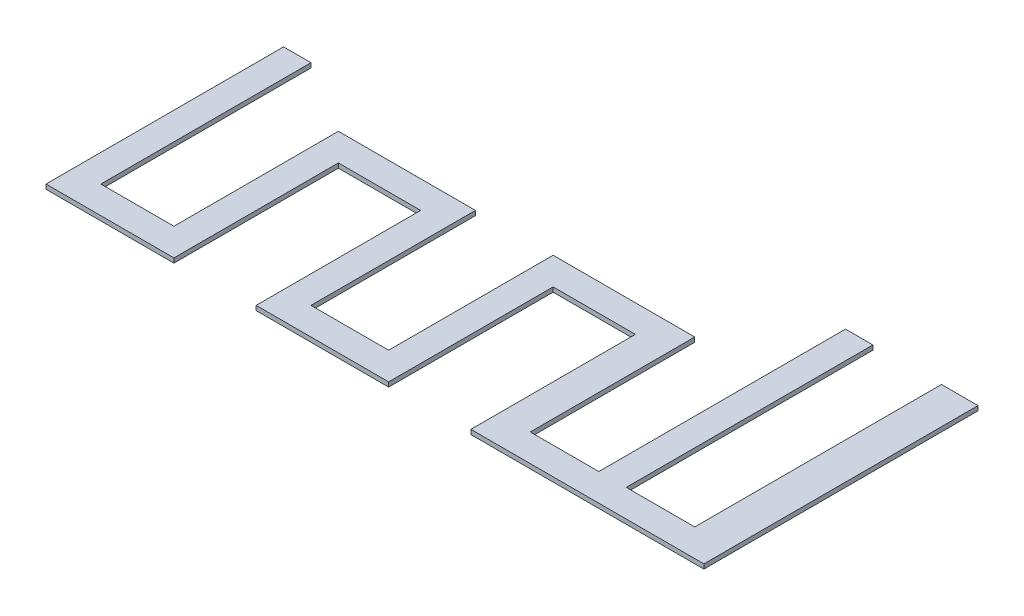
ISO-10303-21;
HEADER;
FILE_DESCRIPTION(('STEP AP214'),'2;1');
FILE_NAME('part.step','',(''),(''),'','','');
FILE_SCHEMA(('AUTOMOTIVE_DESIGN { 1 0 10303 214 1 1 1 1 }'));
ENDSEC;
DATA;
#1=APPLICATION_CONTEXT('core data for automotive mechanical design processes');
#2=APPLICATION_PROTOCOL_DEFINITION('international standard','automotive_design',2000,#1);
#3=PRODUCT_CONTEXT('',#1,'mechanical');
#4=PRODUCT('Part','Part','',(#3));
#5=PRODUCT_RELATED_PRODUCT_CATEGORY('part','',(#4));
#6=PRODUCT_DEFINITION_FORMATION('','',#4);
#7=PRODUCT_DEFINITION_CONTEXT('part definition',#1,'design');
#8=PRODUCT_DEFINITION('design','',#6,#7);
#9=PRODUCT_DEFINITION_SHAPE('','',#8);
#10=(LENGTH_UNIT() NAMED_UNIT(*) SI_UNIT(.MILLI.,.METRE.));
#11=(NAMED_UNIT(*) PLANE_ANGLE_UNIT() SI_UNIT($,.RADIAN.));
#12=(NAMED_UNIT(*) SI_UNIT($,.STERADIAN.) SOLID_ANGLE_UNIT());
#13=UNCERTAINTY_MEASURE_WITH_UNIT(LENGTH_MEASURE(1.E-05),#10,'distance_accuracy_value','');
#14=(GEOMETRIC_REPRESENTATION_CONTEXT(3) GLOBAL_UNCERTAINTY_ASSIGNED_CONTEXT((#13)) GLOBAL_UNIT_ASSIGNED_CONTEXT((#10,
#11,#12)) REPRESENTATION_CONTEXT('',''));
#15=CARTESIAN_POINT('',(0.,0.,0.));
#16=DIRECTION('',(0.,0.,1.));
#17=DIRECTION('',(1.,0.,0.));
#18=AXIS2_PLACEMENT_3D('',#15,#16,#17);
#19=CARTESIAN_POINT('',(-36.74,0.1,11.7573895615759));
#20=DIRECTION('',(0.,0.,1.));
#21=DIRECTION('',(1.,0.,0.));
#22=AXIS2_PLACEMENT_3D('',#19,#20,#21);
#23=PLANE('',#22);
#24=DIRECTION('',(-1.,0.,0.));
#25=VECTOR('',#24,1.);
#26=CARTESIAN_POINT('',(-36.74,0.,11.7573895615759));
#27=LINE('',#26,#25);
#28=CARTESIAN_POINT('',(-36.74,0.,11.7573895615759));
#29=VERTEX_POINT('',#28);
#30=CARTESIAN_POINT('',(-37.34,0.,11.7573895615759));
#31=VERTEX_POINT('',#30);
#32=EDGE_CURVE('E252',#29,#31,#27,.T.);
#33=ORIENTED_EDGE('',*,*,#32,.T.);
#34=DIRECTION('',(0.,-1.,0.));
#35=VECTOR('',#34,1.);
#36=CARTESIAN_POINT('',(-37.34,0.1,11.7573895615759));
#37=LINE('',#36,#35);
#38=CARTESIAN_POINT('',(-37.34,0.1,11.7573895615759));
#39=VERTEX_POINT('',#38);
#40=EDGE_CURVE('E11',#39,#31,#37,.T.);
#41=ORIENTED_EDGE('',*,*,#40,.F.);
#42=DIRECTION('',(-1.,0.,0.));
#43=VECTOR('',#42,1.);
#44=CARTESIAN_POINT('',(-36.74,0.1,11.7573895615759));
#45=LINE('',#44,#43);
#46=CARTESIAN_POINT('',(-36.74,0.1,11.7573895615759));
#47=VERTEX_POINT('',#46);
#48=EDGE_CURVE('E306',#47,#39,#45,.T.);
#49=ORIENTED_EDGE('',*,*,#48,.F.);
#50=DIRECTION('',(0.,-1.,0.));
#51=VECTOR('',#50,1.);
#52=CARTESIAN_POINT('',(-36.74,0.1,11.7573895615759));
#53=LINE('',#52,#51);
#54=EDGE_CURVE('E248',#47,#29,#53,.T.);
#55=ORIENTED_EDGE('',*,*,#54,.T.);
#56=EDGE_LOOP('',(#33,#41,#49,#55));
#57=FACE_BOUND('',#56,.T.);
#58=ADVANCED_FACE('F36',(#57),#23,.F.);
#59=CARTESIAN_POINT('',(-37.34,0.1,11.7573895615759));
#60=DIRECTION('',(1.,0.,0.));
#61=DIRECTION('',(0.,0.,-1.));
#62=AXIS2_PLACEMENT_3D('',#59,#60,#61);
#63=PLANE('',#62);
#64=DIRECTION('',(0.,0.,1.));
#65=VECTOR('',#64,1.);
#66=CARTESIAN_POINT('',(-37.34,0.,11.7573895615759));
#67=LINE('',#66,#65);
#68=CARTESIAN_POINT('',(-37.34,0.,16.9573895615759));
#69=VERTEX_POINT('',#68);
#70=EDGE_CURVE('E255',#31,#69,#67,.T.);
#71=ORIENTED_EDGE('',*,*,#70,.T.);
#72=DIRECTION('',(0.,-1.,0.));
#73=VECTOR('',#72,1.);
#74=CARTESIAN_POINT('',(-37.34,0.1,16.9573895615759));
#75=LINE('',#74,#73);
#76=CARTESIAN_POINT('',(-37.34,0.1,16.9573895615759));
#77=VERTEX_POINT('',#76);
#78=EDGE_CURVE('E44',#77,#69,#75,.T.);
#79=ORIENTED_EDGE('',*,*,#78,.F.);
#80=DIRECTION('',(0.,0.,1.));
#81=VECTOR('',#80,1.);
#82=CARTESIAN_POINT('',(-37.34,0.1,11.7573895615759));
#83=LINE('',#82,#81);
#84=EDGE_CURVE('E155',#39,#77,#83,.T.);
#85=ORIENTED_EDGE('',*,*,#84,.F.);
#86=ORIENTED_EDGE('',*,*,#40,.T.);
#87=EDGE_LOOP('',(#71,#79,#85,#86));
#88=FACE_BOUND('',#87,.T.);
#89=ADVANCED_FACE('F464',(#88),#63,.F.);
#90=CARTESIAN_POINT('',(-37.34,0.1,16.9573895615759));
#91=DIRECTION('',(0.,0.,-1.));
#92=DIRECTION('',(-1.,0.,0.));
#93=AXIS2_PLACEMENT_3D('',#90,#91,#92);
#94=PLANE('',#93);
#95=DIRECTION('',(1.,0.,0.));
#96=VECTOR('',#95,1.);
#97=CARTESIAN_POINT('',(-37.34,0.,16.9573895615759));
#98=LINE('',#97,#96);
#99=CARTESIAN_POINT('',(-34.54,0.,16.9573895615759));
#100=VERTEX_POINT('',#99);
#101=EDGE_CURVE('E257',#69,#100,#98,.T.);
#102=ORIENTED_EDGE('',*,*,#101,.T.);
#103=DIRECTION('',(0.,-1.,0.));
#104=VECTOR('',#103,1.);
#105=CARTESIAN_POINT('',(-34.54,0.1,16.9573895615759));
#106=LINE('',#105,#104);
#107=CARTESIAN_POINT('',(-34.54,0.1,16.9573895615759));
#108=VERTEX_POINT('',#107);
#109=EDGE_CURVE('E373',#108,#100,#106,.T.);
#110=ORIENTED_EDGE('',*,*,#109,.F.);
#111=DIRECTION('',(1.,0.,0.));
#112=VECTOR('',#111,1.);
#113=CARTESIAN_POINT('',(-37.34,0.1,16.9573895615759));
#114=LINE('',#113,#112);
#115=EDGE_CURVE('E381',#77,#108,#114,.T.);
#116=ORIENTED_EDGE('',*,*,#115,.F.);
#117=ORIENTED_EDGE('',*,*,#78,.T.);
#118=EDGE_LOOP('',(#102,#110,#116,#117));
#119=FACE_BOUND('',#118,.T.);
#120=ADVANCED_FACE('F379',(#119),#94,.F.);
#121=CARTESIAN_POINT('',(-34.54,0.1,16.9573895615759));
#122=DIRECTION('',(-1.,0.,0.));
#123=DIRECTION('',(0.,0.,1.));
#124=AXIS2_PLACEMENT_3D('',#121,#122,#123);
#125=PLANE('',#124);
#126=DIRECTION('',(0.,0.,-1.));
#127=VECTOR('',#126,1.);
#128=CARTESIAN_POINT('',(-34.54,0.,16.9573895615759));
#129=LINE('',#128,#127);
#130=CARTESIAN_POINT('',(-34.54,0.,13.3573895615759));
#131=VERTEX_POINT('',#130);
#132=EDGE_CURVE('E259',#100,#131,#129,.T.);
#133=ORIENTED_EDGE('',*,*,#132,.T.);
#134=DIRECTION('',(0.,-1.,0.));
#135=VECTOR('',#134,1.);
#136=CARTESIAN_POINT('',(-34.54,0.1,13.3573895615759));
#137=LINE('',#136,#135);
#138=CARTESIAN_POINT('',(-34.54,0.1,13.3573895615759));
#139=VERTEX_POINT('',#138);
#140=EDGE_CURVE('E370',#139,#131,#137,.T.);
#141=ORIENTED_EDGE('',*,*,#140,.F.);
#142=DIRECTION('',(0.,0.,-1.));
#143=VECTOR('',#142,1.);
#144=CARTESIAN_POINT('',(-34.54,0.1,16.9573895615759));
#145=LINE('',#144,#143);
#146=EDGE_CURVE('E399',#108,#139,#145,.T.);
#147=ORIENTED_EDGE('',*,*,#146,.F.);
#148=ORIENTED_EDGE('',*,*,#109,.T.);
#149=EDGE_LOOP('',(#133,#141,#147,#148));
#150=FACE_BOUND('',#149,.T.);
#151=ADVANCED_FACE('F390',(#150),#125,.F.);
#152=CARTESIAN_POINT('',(-34.54,0.1,13.3573895615759));
#153=DIRECTION('',(0.,0.,-1.));
#154=DIRECTION('',(-1.,0.,0.));
#155=AXIS2_PLACEMENT_3D('',#152,#153,#154);
#156=PLANE('',#155);
#157=DIRECTION('',(1.,0.,0.));
#158=VECTOR('',#157,1.);
#159=CARTESIAN_POINT('',(-34.54,0.,13.3573895615759));
#160=LINE('',#159,#158);
#161=CARTESIAN_POINT('',(-32.74,0.,13.3573895615759));
#162=VERTEX_POINT('',#161);
#163=EDGE_CURVE('E261',#131,#162,#160,.T.);
#164=ORIENTED_EDGE('',*,*,#163,.T.);
#165=DIRECTION('',(0.,-1.,0.));
#166=VECTOR('',#165,1.);
#167=CARTESIAN_POINT('',(-32.74,0.1,13.3573895615759));
#168=LINE('',#167,#166);
#169=CARTESIAN_POINT('',(-32.74,0.1,13.3573895615759));
#170=VERTEX_POINT('',#169);
#171=EDGE_CURVE('E367',#170,#162,#168,.T.);
#172=ORIENTED_EDGE('',*,*,#171,.F.);
#173=DIRECTION('',(1.,0.,0.));
#174=VECTOR('',#173,1.);
#175=CARTESIAN_POINT('',(-34.54,0.1,13.3573895615759));
#176=LINE('',#175,#174);
#177=EDGE_CURVE('E396',#139,#170,#176,.T.);
#178=ORIENTED_EDGE('',*,*,#177,.F.);
#179=ORIENTED_EDGE('',*,*,#140,.T.);
#180=EDGE_LOOP('',(#164,#172,#178,#179));
#181=FACE_BOUND('',#180,.T.);
#182=ADVANCED_FACE('F394',(#181),#156,.F.);
#183=CARTESIAN_POINT('',(-32.74,0.1,13.3573895615759));
#184=DIRECTION('',(1.,0.,0.));
#185=DIRECTION('',(0.,0.,-1.));
#186=AXIS2_PLACEMENT_3D('',#183,#184,#185);
#187=PLANE('',#186);
#188=DIRECTION('',(0.,0.,1.));
#189=VECTOR('',#188,1.);
#190=CARTESIAN_POINT('',(-32.74,0.,13.3573895615759));
#191=LINE('',#190,#189);
#192=CARTESIAN_POINT('',(-32.74,0.,16.9573895615759));
#193=VERTEX_POINT('',#192);
#194=EDGE_CURVE('E263',#162,#193,#191,.T.);
#195=ORIENTED_EDGE('',*,*,#194,.T.);
#196=DIRECTION('',(0.,-1.,0.));
#197=VECTOR('',#196,1.);
#198=CARTESIAN_POINT('',(-32.74,0.1,16.9573895615759));
#199=LINE('',#198,#197);
#200=CARTESIAN_POINT('',(-32.74,0.1,16.9573895615759));
#201=VERTEX_POINT('',#200);
#202=EDGE_CURVE('E364',#201,#193,#199,.T.);
#203=ORIENTED_EDGE('',*,*,#202,.F.);
#204=DIRECTION('',(0.,0.,1.));
#205=VECTOR('',#204,1.);
#206=CARTESIAN_POINT('',(-32.74,0.1,13.3573895615759));
#207=LINE('',#206,#205);
#208=EDGE_CURVE('E398',#170,#201,#207,.T.);
#209=ORIENTED_EDGE('',*,*,#208,.F.);
#210=ORIENTED_EDGE('',*,*,#171,.T.);
#211=EDGE_LOOP('',(#195,#203,#209,#210));
#212=FACE_BOUND('',#211,.T.);
#213=ADVANCED_FACE('F477',(#212),#187,.F.);
#214=CARTESIAN_POINT('',(-32.74,0.1,16.9573895615759));
#215=DIRECTION('',(0.,0.,-1.));
#216=DIRECTION('',(-1.,0.,0.));
#217=AXIS2_PLACEMENT_3D('',#214,#215,#216);
#218=PLANE('',#217);
#219=DIRECTION('',(1.,0.,0.));
#220=VECTOR('',#219,1.);
#221=CARTESIAN_POINT('',(-32.74,0.,16.9573895615759));
#222=LINE('',#221,#220);
#223=CARTESIAN_POINT('',(-29.84,0.,16.9573895615759));
#224=VERTEX_POINT('',#223);
#225=EDGE_CURVE('E265',#193,#224,#222,.T.);
#226=ORIENTED_EDGE('',*,*,#225,.T.);
#227=DIRECTION('',(0.,-1.,0.));
#228=VECTOR('',#227,1.);
#229=CARTESIAN_POINT('',(-29.84,0.1,16.9573895615759));
#230=LINE('',#229,#228);
#231=CARTESIAN_POINT('',(-29.84,0.1,16.9573895615759));
#232=VERTEX_POINT('',#231);
#233=EDGE_CURVE('E361',#232,#224,#230,.T.);
#234=ORIENTED_EDGE('',*,*,#233,.F.);
#235=DIRECTION('',(1.,0.,0.));
#236=VECTOR('',#235,1.);
#237=CARTESIAN_POINT('',(-32.74,0.1,16.9573895615759));
#238=LINE('',#237,#236);
#239=EDGE_CURVE('E401',#201,#232,#238,.T.);
#240=ORIENTED_EDGE('',*,*,#239,.F.);
#241=ORIENTED_EDGE('',*,*,#202,.T.);
#242=EDGE_LOOP('',(#226,#234,#240,#241));
#243=FACE_BOUND('',#242,.T.);
#244=ADVANCED_FACE('F480',(#243),#218,.F.);
#245=CARTESIAN_POINT('',(-29.84,0.1,16.9573895615759));
#246=DIRECTION('',(-1.,0.,0.));
#247=DIRECTION('',(0.,0.,1.));
#248=AXIS2_PLACEMENT_3D('',#245,#246,#247);
#249=PLANE('',#248);
#250=DIRECTION('',(0.,0.,-1.));
#251=VECTOR('',#250,1.);
#252=CARTESIAN_POINT('',(-29.84,0.,16.9573895615759));
#253=LINE('',#252,#251);
#254=CARTESIAN_POINT('',(-29.84,0.,13.3573895615759));
#255=VERTEX_POINT('',#254);
#256=EDGE_CURVE('E267',#224,#255,#253,.T.);
#257=ORIENTED_EDGE('',*,*,#256,.T.);
#258=DIRECTION('',(0.,-1.,0.));
#259=VECTOR('',#258,1.);
#260=CARTESIAN_POINT('',(-29.84,0.1,13.3573895615759));
#261=LINE('',#260,#259);
#262=CARTESIAN_POINT('',(-29.84,0.1,13.3573895615759));
#263=VERTEX_POINT('',#262);
#264=EDGE_CURVE('E358',#263,#255,#261,.T.);
#265=ORIENTED_EDGE('',*,*,#264,.F.);
#266=DIRECTION('',(0.,0.,-1.));
#267=VECTOR('',#266,1.);
#268=CARTESIAN_POINT('',(-29.84,0.1,16.9573895615759));
#269=LINE('',#268,#267);
#270=EDGE_CURVE('E407',#232,#263,#269,.T.);
#271=ORIENTED_EDGE('',*,*,#270,.F.);
#272=ORIENTED_EDGE('',*,*,#233,.T.);
#273=EDGE_LOOP('',(#257,#265,#271,#272));
#274=FACE_BOUND('',#273,.T.);
#275=ADVANCED_FACE('F484',(#274),#249,.F.);
#276=CARTESIAN_POINT('',(-29.84,0.1,13.3573895615759));
#277=DIRECTION('',(0.,0.,-1.));
#278=DIRECTION('',(-1.,0.,0.));
#279=AXIS2_PLACEMENT_3D('',#276,#277,#278);
#280=PLANE('',#279);
#281=DIRECTION('',(1.,0.,0.));
#282=VECTOR('',#281,1.);
#283=CARTESIAN_POINT('',(-29.84,0.,13.3573895615759));
#284=LINE('',#283,#282);
#285=CARTESIAN_POINT('',(-28.04,0.,13.3573895615759));
#286=VERTEX_POINT('',#285);
#287=EDGE_CURVE('E269',#255,#286,#284,.T.);
#288=ORIENTED_EDGE('',*,*,#287,.T.);
#289=DIRECTION('',(0.,-1.,0.));
#290=VECTOR('',#289,1.);
#291=CARTESIAN_POINT('',(-28.04,0.1,13.3573895615759));
#292=LINE('',#291,#290);
#293=CARTESIAN_POINT('',(-28.04,0.1,13.3573895615759));
#294=VERTEX_POINT('',#293);
#295=EDGE_CURVE('E355',#294,#286,#292,.T.);
#296=ORIENTED_EDGE('',*,*,#295,.F.);
#297=DIRECTION('',(1.,0.,0.));
#298=VECTOR('',#297,1.);
#299=CARTESIAN_POINT('',(-29.84,0.1,13.3573895615759));
#300=LINE('',#299,#298);
#301=EDGE_CURVE('E409',#263,#294,#300,.T.);
#302=ORIENTED_EDGE('',*,*,#301,.F.);
#303=ORIENTED_EDGE('',*,*,#264,.T.);
#304=EDGE_LOOP('',(#288,#296,#302,#303));
#305=FACE_BOUND('',#304,.T.);
#306=ADVANCED_FACE('F488',(#305),#280,.F.);
#307=CARTESIAN_POINT('',(-28.04,0.1,13.3573895615759));
#308=DIRECTION('',(1.,0.,0.));
#309=DIRECTION('',(0.,0.,-1.));
#310=AXIS2_PLACEMENT_3D('',#307,#308,#309);
#311=PLANE('',#310);
#312=DIRECTION('',(0.,0.,1.));
#313=VECTOR('',#312,1.);
#314=CARTESIAN_POINT('',(-28.04,0.,13.3573895615759));
#315=LINE('',#314,#313);
#316=CARTESIAN_POINT('',(-28.04,0.,16.9573895615759));
#317=VERTEX_POINT('',#316);
#318=EDGE_CURVE('E271',#286,#317,#315,.T.);
#319=ORIENTED_EDGE('',*,*,#318,.T.);
#320=DIRECTION('',(0.,-1.,0.));
#321=VECTOR('',#320,1.);
#322=CARTESIAN_POINT('',(-28.04,0.1,16.9573895615759));
#323=LINE('',#322,#321);
#324=CARTESIAN_POINT('',(-28.04,0.1,16.9573895615759));
#325=VERTEX_POINT('',#324);
#326=EDGE_CURVE('E352',#325,#317,#323,.T.);
#327=ORIENTED_EDGE('',*,*,#326,.F.);
#328=DIRECTION('',(0.,0.,1.));
#329=VECTOR('',#328,1.);
#330=CARTESIAN_POINT('',(-28.04,0.1,13.3573895615759));
#331=LINE('',#330,#329);
#332=EDGE_CURVE('E411',#294,#325,#331,.T.);
#333=ORIENTED_EDGE('',*,*,#332,.F.);
#334=ORIENTED_EDGE('',*,*,#295,.T.);
#335=EDGE_LOOP('',(#319,#327,#333,#334));
#336=FACE_BOUND('',#335,.T.);
#337=ADVANCED_FACE('F492',(#336),#311,.F.);
#338=CARTESIAN_POINT('',(-28.04,0.1,16.9573895615759));
#339=DIRECTION('',(0.,0.,-1.));
#340=DIRECTION('',(-1.,0.,0.));
#341=AXIS2_PLACEMENT_3D('',#338,#339,#340);
#342=PLANE('',#341);
#343=DIRECTION('',(1.,0.,0.));
#344=VECTOR('',#343,1.);
#345=CARTESIAN_POINT('',(-28.04,0.,16.9573895615759));
#346=LINE('',#345,#344);
#347=CARTESIAN_POINT('',(-22.94,0.,16.9573895615759));
#348=VERTEX_POINT('',#347);
#349=EDGE_CURVE('E273',#317,#348,#346,.T.);
#350=ORIENTED_EDGE('',*,*,#349,.T.);
#351=DIRECTION('',(0.,-1.,0.));
#352=VECTOR('',#351,1.);
#353=CARTESIAN_POINT('',(-22.94,0.1,16.9573895615759));
#354=LINE('',#353,#352);
#355=CARTESIAN_POINT('',(-22.94,0.1,16.9573895615759));
#356=VERTEX_POINT('',#355);
#357=EDGE_CURVE('E349',#356,#348,#354,.T.);
#358=ORIENTED_EDGE('',*,*,#357,.F.);
#359=DIRECTION('',(1.,0.,0.));
#360=VECTOR('',#359,1.);
#361=CARTESIAN_POINT('',(-28.04,0.1,16.9573895615759));
#362=LINE('',#361,#360);
#363=EDGE_CURVE('E413',#325,#356,#362,.T.);
#364=ORIENTED_EDGE('',*,*,#363,.F.);
#365=ORIENTED_EDGE('',*,*,#326,.T.);
#366=EDGE_LOOP('',(#350,#358,#364,#365));
#367=FACE_BOUND('',#366,.T.);
#368=ADVANCED_FACE('F496',(#367),#342,.F.);
#369=CARTESIAN_POINT('',(-22.94,0.1,16.9573895615759));
#370=DIRECTION('',(-1.,0.,0.));
#371=DIRECTION('',(0.,0.,1.));
#372=AXIS2_PLACEMENT_3D('',#369,#370,#371);
#373=PLANE('',#372);
#374=DIRECTION('',(0.,0.,-1.));
#375=VECTOR('',#374,1.);
#376=CARTESIAN_POINT('',(-22.94,0.,16.9573895615759));
#377=LINE('',#376,#375);
#378=CARTESIAN_POINT('',(-22.94,0.,10.9573895615759));
#379=VERTEX_POINT('',#378);
#380=EDGE_CURVE('E275',#348,#379,#377,.T.);
#381=ORIENTED_EDGE('',*,*,#380,.T.);
#382=DIRECTION('',(0.,-1.,0.));
#383=VECTOR('',#382,1.);
#384=CARTESIAN_POINT('',(-22.94,0.1,10.9573895615759));
#385=LINE('',#384,#383);
#386=CARTESIAN_POINT('',(-22.94,0.1,10.9573895615759));
#387=VERTEX_POINT('',#386);
#388=EDGE_CURVE('E346',#387,#379,#385,.T.);
#389=ORIENTED_EDGE('',*,*,#388,.F.);
#390=DIRECTION('',(0.,0.,-1.));
#391=VECTOR('',#390,1.);
#392=CARTESIAN_POINT('',(-22.94,0.1,16.9573895615759));
#393=LINE('',#392,#391);
#394=EDGE_CURVE('E415',#356,#387,#393,.T.);
#395=ORIENTED_EDGE('',*,*,#394,.F.);
#396=ORIENTED_EDGE('',*,*,#357,.T.);
#397=EDGE_LOOP('',(#381,#389,#395,#396));
#398=FACE_BOUND('',#397,.T.);
#399=ADVANCED_FACE('F500',(#398),#373,.F.);
#400=CARTESIAN_POINT('',(-22.94,0.1,10.9573895615759));
#401=DIRECTION('',(0.,0.,1.));
#402=DIRECTION('',(1.,0.,0.));
#403=AXIS2_PLACEMENT_3D('',#400,#401,#402);
#404=PLANE('',#403);
#405=DIRECTION('',(-1.,0.,0.));
#406=VECTOR('',#405,1.);
#407=CARTESIAN_POINT('',(-22.94,0.,10.9573895615759));
#408=LINE('',#407,#406);
#409=CARTESIAN_POINT('',(-23.74,0.,10.9573895615759));
#410=VERTEX_POINT('',#409);
#411=EDGE_CURVE('E277',#379,#410,#408,.T.);
#412=ORIENTED_EDGE('',*,*,#411,.T.);
#413=DIRECTION('',(0.,-1.,0.));
#414=VECTOR('',#413,1.);
#415=CARTESIAN_POINT('',(-23.74,0.1,10.9573895615759));
#416=LINE('',#415,#414);
#417=CARTESIAN_POINT('',(-23.74,0.1,10.9573895615759));
#418=VERTEX_POINT('',#417);
#419=EDGE_CURVE('E343',#418,#410,#416,.T.);
#420=ORIENTED_EDGE('',*,*,#419,.F.);
#421=DIRECTION('',(-1.,0.,0.));
#422=VECTOR('',#421,1.);
#423=CARTESIAN_POINT('',(-22.94,0.1,10.9573895615759));
#424=LINE('',#423,#422);
#425=EDGE_CURVE('E417',#387,#418,#424,.T.);
#426=ORIENTED_EDGE('',*,*,#425,.F.);
#427=ORIENTED_EDGE('',*,*,#388,.T.);
#428=EDGE_LOOP('',(#412,#420,#426,#427));
#429=FACE_BOUND('',#428,.T.);
#430=ADVANCED_FACE('F504',(#429),#404,.F.);
#431=CARTESIAN_POINT('',(-23.74,0.1,10.9573895615759));
#432=DIRECTION('',(1.,0.,0.));
#433=DIRECTION('',(0.,0.,-1.));
#434=AXIS2_PLACEMENT_3D('',#431,#432,#433);
#435=PLANE('',#434);
#436=DIRECTION('',(0.,0.,1.));
#437=VECTOR('',#436,1.);
#438=CARTESIAN_POINT('',(-23.74,0.,10.9573895615759));
#439=LINE('',#438,#437);
#440=CARTESIAN_POINT('',(-23.74,0.,16.3573895615759));
#441=VERTEX_POINT('',#440);
#442=EDGE_CURVE('E279',#410,#441,#439,.T.);
#443=ORIENTED_EDGE('',*,*,#442,.T.);
#444=DIRECTION('',(0.,-1.,0.));
#445=VECTOR('',#444,1.);
#446=CARTESIAN_POINT('',(-23.74,0.1,16.3573895615759));
#447=LINE('',#446,#445);
#448=CARTESIAN_POINT('',(-23.74,0.1,16.3573895615759));
#449=VERTEX_POINT('',#448);
#450=EDGE_CURVE('E340',#449,#441,#447,.T.);
#451=ORIENTED_EDGE('',*,*,#450,.F.);
#452=DIRECTION('',(0.,0.,1.));
#453=VECTOR('',#452,1.);
#454=CARTESIAN_POINT('',(-23.74,0.1,10.9573895615759));
#455=LINE('',#454,#453);
#456=EDGE_CURVE('E419',#418,#449,#455,.T.);
#457=ORIENTED_EDGE('',*,*,#456,.F.);
#458=ORIENTED_EDGE('',*,*,#419,.T.);
#459=EDGE_LOOP('',(#443,#451,#457,#458));
#460=FACE_BOUND('',#459,.T.);
#461=ADVANCED_FACE('F508',(#460),#435,.F.);
#462=CARTESIAN_POINT('',(-23.74,0.1,16.3573895615759));
#463=DIRECTION('',(0.,0.,1.));
#464=DIRECTION('',(1.,0.,0.));
#465=AXIS2_PLACEMENT_3D('',#462,#463,#464);
#466=PLANE('',#465);
#467=DIRECTION('',(-1.,0.,0.));
#468=VECTOR('',#467,1.);
#469=CARTESIAN_POINT('',(-23.74,0.,16.3573895615759));
#470=LINE('',#469,#468);
#471=CARTESIAN_POINT('',(-25.24,0.,16.3573895615759));
#472=VERTEX_POINT('',#471);
#473=EDGE_CURVE('E281',#441,#472,#470,.T.);
#474=ORIENTED_EDGE('',*,*,#473,.T.);
#475=DIRECTION('',(0.,-1.,0.));
#476=VECTOR('',#475,1.);
#477=CARTESIAN_POINT('',(-25.24,0.1,16.3573895615759));
#478=LINE('',#477,#476);
#479=CARTESIAN_POINT('',(-25.24,0.1,16.3573895615759));
#480=VERTEX_POINT('',#479);
#481=EDGE_CURVE('E337',#480,#472,#478,.T.);
#482=ORIENTED_EDGE('',*,*,#481,.F.);
#483=DIRECTION('',(-1.,0.,0.));
#484=VECTOR('',#483,1.);
#485=CARTESIAN_POINT('',(-23.74,0.1,16.3573895615759));
#486=LINE('',#485,#484);
#487=EDGE_CURVE('E421',#449,#480,#486,.T.);
#488=ORIENTED_EDGE('',*,*,#487,.F.);
#489=ORIENTED_EDGE('',*,*,#450,.T.);
#490=EDGE_LOOP('',(#474,#482,#488,#489));
#491=FACE_BOUND('',#490,.T.);
#492=ADVANCED_FACE('F512',(#491),#466,.F.);
#493=CARTESIAN_POINT('',(-25.24,0.1,16.3573895615759));
#494=DIRECTION('',(-1.,0.,0.));
#495=DIRECTION('',(0.,0.,1.));
#496=AXIS2_PLACEMENT_3D('',#493,#494,#495);
#497=PLANE('',#496);
#498=DIRECTION('',(0.,0.,-1.));
#499=VECTOR('',#498,1.);
#500=CARTESIAN_POINT('',(-25.24,0.,16.3573895615759));
#501=LINE('',#500,#499);
#502=CARTESIAN_POINT('',(-25.24,0.,10.9573895615759));
#503=VERTEX_POINT('',#502);
#504=EDGE_CURVE('E283',#472,#503,#501,.T.);
#505=ORIENTED_EDGE('',*,*,#504,.T.);
#506=DIRECTION('',(0.,-1.,0.));
#507=VECTOR('',#506,1.);
#508=CARTESIAN_POINT('',(-25.24,0.1,10.9573895615759));
#509=LINE('',#508,#507);
#510=CARTESIAN_POINT('',(-25.24,0.1,10.9573895615759));
#511=VERTEX_POINT('',#510);
#512=EDGE_CURVE('E334',#511,#503,#509,.T.);
#513=ORIENTED_EDGE('',*,*,#512,.F.);
#514=DIRECTION('',(0.,0.,-1.));
#515=VECTOR('',#514,1.);
#516=CARTESIAN_POINT('',(-25.24,0.1,16.3573895615759));
#517=LINE('',#516,#515);
#518=EDGE_CURVE('E423',#480,#511,#517,.T.);
#519=ORIENTED_EDGE('',*,*,#518,.F.);
#520=ORIENTED_EDGE('',*,*,#481,.T.);
#521=EDGE_LOOP('',(#505,#513,#519,#520));
#522=FACE_BOUND('',#521,.T.);
#523=ADVANCED_FACE('F516',(#522),#497,.F.);
#524=CARTESIAN_POINT('',(-25.24,0.1,10.9573895615759));
#525=DIRECTION('',(0.,0.,1.));
#526=DIRECTION('',(1.,0.,0.));
#527=AXIS2_PLACEMENT_3D('',#524,#525,#526);
#528=PLANE('',#527);
#529=DIRECTION('',(-1.,0.,0.));
#530=VECTOR('',#529,1.);
#531=CARTESIAN_POINT('',(-25.24,0.,10.9573895615759));
#532=LINE('',#531,#530);
#533=CARTESIAN_POINT('',(-25.84,0.,10.9573895615759));
#534=VERTEX_POINT('',#533);
#535=EDGE_CURVE('E285',#503,#534,#532,.T.);
#536=ORIENTED_EDGE('',*,*,#535,.T.);
#537=DIRECTION('',(0.,-1.,0.));
#538=VECTOR('',#537,1.);
#539=CARTESIAN_POINT('',(-25.84,0.1,10.9573895615759));
#540=LINE('',#539,#538);
#541=CARTESIAN_POINT('',(-25.84,0.1,10.9573895615759));
#542=VERTEX_POINT('',#541);
#543=EDGE_CURVE('E331',#542,#534,#540,.T.);
#544=ORIENTED_EDGE('',*,*,#543,.F.);
#545=DIRECTION('',(-1.,0.,0.));
#546=VECTOR('',#545,1.);
#547=CARTESIAN_POINT('',(-25.24,0.1,10.9573895615759));
#548=LINE('',#547,#546);
#549=EDGE_CURVE('E425',#511,#542,#548,.T.);
#550=ORIENTED_EDGE('',*,*,#549,.F.);
#551=ORIENTED_EDGE('',*,*,#512,.T.);
#552=EDGE_LOOP('',(#536,#544,#550,#551));
#553=FACE_BOUND('',#552,.T.);
#554=ADVANCED_FACE('F520',(#553),#528,.F.);
#555=CARTESIAN_POINT('',(-25.84,0.1,10.9573895615759));
#556=DIRECTION('',(1.,0.,0.));
#557=DIRECTION('',(0.,0.,-1.));
#558=AXIS2_PLACEMENT_3D('',#555,#556,#557);
#559=PLANE('',#558);
#560=DIRECTION('',(0.,0.,1.));
#561=VECTOR('',#560,1.);
#562=CARTESIAN_POINT('',(-25.84,0.,10.9573895615759));
#563=LINE('',#562,#561);
#564=CARTESIAN_POINT('',(-25.84,0.,16.3573895615759));
#565=VERTEX_POINT('',#564);
#566=EDGE_CURVE('E287',#534,#565,#563,.T.);
#567=ORIENTED_EDGE('',*,*,#566,.T.);
#568=DIRECTION('',(0.,-1.,0.));
#569=VECTOR('',#568,1.);
#570=CARTESIAN_POINT('',(-25.84,0.1,16.3573895615759));
#571=LINE('',#570,#569);
#572=CARTESIAN_POINT('',(-25.84,0.1,16.3573895615759));
#573=VERTEX_POINT('',#572);
#574=EDGE_CURVE('E328',#573,#565,#571,.T.);
#575=ORIENTED_EDGE('',*,*,#574,.F.);
#576=DIRECTION('',(0.,0.,1.));
#577=VECTOR('',#576,1.);
#578=CARTESIAN_POINT('',(-25.84,0.1,10.9573895615759));
#579=LINE('',#578,#577);
#580=EDGE_CURVE('E427',#542,#573,#579,.T.);
#581=ORIENTED_EDGE('',*,*,#580,.F.);
#582=ORIENTED_EDGE('',*,*,#543,.T.);
#583=EDGE_LOOP('',(#567,#575,#581,#582));
#584=FACE_BOUND('',#583,.T.);
#585=ADVANCED_FACE('F524',(#584),#559,.F.);
#586=CARTESIAN_POINT('',(-25.84,0.1,16.3573895615759));
#587=DIRECTION('',(0.,0.,1.));
#588=DIRECTION('',(1.,0.,0.));
#589=AXIS2_PLACEMENT_3D('',#586,#587,#588);
#590=PLANE('',#589);
#591=DIRECTION('',(-1.,0.,0.));
#592=VECTOR('',#591,1.);
#593=CARTESIAN_POINT('',(-25.84,0.,16.3573895615759));
#594=LINE('',#593,#592);
#595=CARTESIAN_POINT('',(-27.34,0.,16.3573895615759));
#596=VERTEX_POINT('',#595);
#597=EDGE_CURVE('E289',#565,#596,#594,.T.);
#598=ORIENTED_EDGE('',*,*,#597,.T.);
#599=DIRECTION('',(0.,-1.,0.));
#600=VECTOR('',#599,1.);
#601=CARTESIAN_POINT('',(-27.34,0.1,16.3573895615759));
#602=LINE('',#601,#600);
#603=CARTESIAN_POINT('',(-27.34,0.1,16.3573895615759));
#604=VERTEX_POINT('',#603);
#605=EDGE_CURVE('E325',#604,#596,#602,.T.);
#606=ORIENTED_EDGE('',*,*,#605,.F.);
#607=DIRECTION('',(-1.,0.,0.));
#608=VECTOR('',#607,1.);
#609=CARTESIAN_POINT('',(-25.84,0.1,16.3573895615759));
#610=LINE('',#609,#608);
#611=EDGE_CURVE('E429',#573,#604,#610,.T.);
#612=ORIENTED_EDGE('',*,*,#611,.F.);
#613=ORIENTED_EDGE('',*,*,#574,.T.);
#614=EDGE_LOOP('',(#598,#606,#612,#613));
#615=FACE_BOUND('',#614,.T.);
#616=ADVANCED_FACE('F528',(#615),#590,.F.);
#617=CARTESIAN_POINT('',(-27.34,0.1,16.3573895615759));
#618=DIRECTION('',(-1.,0.,0.));
#619=DIRECTION('',(0.,0.,1.));
#620=AXIS2_PLACEMENT_3D('',#617,#618,#619);
#621=PLANE('',#620);
#622=DIRECTION('',(0.,0.,-1.));
#623=VECTOR('',#622,1.);
#624=CARTESIAN_POINT('',(-27.34,0.,16.3573895615759));
#625=LINE('',#624,#623);
#626=CARTESIAN_POINT('',(-27.34,0.,12.7573895615759));
#627=VERTEX_POINT('',#626);
#628=EDGE_CURVE('E291',#596,#627,#625,.T.);
#629=ORIENTED_EDGE('',*,*,#628,.T.);
#630=DIRECTION('',(0.,-1.,0.));
#631=VECTOR('',#630,1.);
#632=CARTESIAN_POINT('',(-27.34,0.1,12.7573895615759));
#633=LINE('',#632,#631);
#634=CARTESIAN_POINT('',(-27.34,0.1,12.7573895615759));
#635=VERTEX_POINT('',#634);
#636=EDGE_CURVE('E322',#635,#627,#633,.T.);
#637=ORIENTED_EDGE('',*,*,#636,.F.);
#638=DIRECTION('',(0.,0.,-1.));
#639=VECTOR('',#638,1.);
#640=CARTESIAN_POINT('',(-27.34,0.1,16.3573895615759));
#641=LINE('',#640,#639);
#642=EDGE_CURVE('E431',#604,#635,#641,.T.);
#643=ORIENTED_EDGE('',*,*,#642,.F.);
#644=ORIENTED_EDGE('',*,*,#605,.T.);
#645=EDGE_LOOP('',(#629,#637,#643,#644));
#646=FACE_BOUND('',#645,.T.);
#647=ADVANCED_FACE('F532',(#646),#621,.F.);
#648=CARTESIAN_POINT('',(-27.34,0.1,12.7573895615759));
#649=DIRECTION('',(0.,0.,1.));
#650=DIRECTION('',(1.,0.,0.));
#651=AXIS2_PLACEMENT_3D('',#648,#649,#650);
#652=PLANE('',#651);
#653=DIRECTION('',(-1.,0.,0.));
#654=VECTOR('',#653,1.);
#655=CARTESIAN_POINT('',(-27.34,0.,12.7573895615759));
#656=LINE('',#655,#654);
#657=CARTESIAN_POINT('',(-30.44,0.,12.7573895615759));
#658=VERTEX_POINT('',#657);
#659=EDGE_CURVE('E293',#627,#658,#656,.T.);
#660=ORIENTED_EDGE('',*,*,#659,.T.);
#661=DIRECTION('',(0.,-1.,0.));
#662=VECTOR('',#661,1.);
#663=CARTESIAN_POINT('',(-30.44,0.1,12.7573895615759));
#664=LINE('',#663,#662);
#665=CARTESIAN_POINT('',(-30.44,0.1,12.7573895615759));
#666=VERTEX_POINT('',#665);
#667=EDGE_CURVE('E319',#666,#658,#664,.T.);
#668=ORIENTED_EDGE('',*,*,#667,.F.);
#669=DIRECTION('',(-1.,0.,0.));
#670=VECTOR('',#669,1.);
#671=CARTESIAN_POINT('',(-27.34,0.1,12.7573895615759));
#672=LINE('',#671,#670);
#673=EDGE_CURVE('E433',#635,#666,#672,.T.);
#674=ORIENTED_EDGE('',*,*,#673,.F.);
#675=ORIENTED_EDGE('',*,*,#636,.T.);
#676=EDGE_LOOP('',(#660,#668,#674,#675));
#677=FACE_BOUND('',#676,.T.);
#678=ADVANCED_FACE('F536',(#677),#652,.F.);
#679=CARTESIAN_POINT('',(-30.44,0.1,12.7573895615759));
#680=DIRECTION('',(1.,0.,0.));
#681=DIRECTION('',(0.,0.,-1.));
#682=AXIS2_PLACEMENT_3D('',#679,#680,#681);
#683=PLANE('',#682);
#684=DIRECTION('',(0.,0.,1.));
#685=VECTOR('',#684,1.);
#686=CARTESIAN_POINT('',(-30.44,0.,12.7573895615759));
#687=LINE('',#686,#685);
#688=CARTESIAN_POINT('',(-30.44,0.,16.3573895615759));
#689=VERTEX_POINT('',#688);
#690=EDGE_CURVE('E295',#658,#689,#687,.T.);
#691=ORIENTED_EDGE('',*,*,#690,.T.);
#692=DIRECTION('',(0.,-1.,0.));
#693=VECTOR('',#692,1.);
#694=CARTESIAN_POINT('',(-30.44,0.1,16.3573895615759));
#695=LINE('',#694,#693);
#696=CARTESIAN_POINT('',(-30.44,0.1,16.3573895615759));
#697=VERTEX_POINT('',#696);
#698=EDGE_CURVE('E316',#697,#689,#695,.T.);
#699=ORIENTED_EDGE('',*,*,#698,.F.);
#700=DIRECTION('',(0.,0.,1.));
#701=VECTOR('',#700,1.);
#702=CARTESIAN_POINT('',(-30.44,0.1,12.7573895615759));
#703=LINE('',#702,#701);
#704=EDGE_CURVE('E435',#666,#697,#703,.T.);
#705=ORIENTED_EDGE('',*,*,#704,.F.);
#706=ORIENTED_EDGE('',*,*,#667,.T.);
#707=EDGE_LOOP('',(#691,#699,#705,#706));
#708=FACE_BOUND('',#707,.T.);
#709=ADVANCED_FACE('F540',(#708),#683,.F.);
#710=CARTESIAN_POINT('',(-30.44,0.1,16.3573895615759));
#711=DIRECTION('',(0.,0.,1.));
#712=DIRECTION('',(1.,0.,0.));
#713=AXIS2_PLACEMENT_3D('',#710,#711,#712);
#714=PLANE('',#713);
#715=DIRECTION('',(-1.,0.,0.));
#716=VECTOR('',#715,1.);
#717=CARTESIAN_POINT('',(-30.44,0.,16.3573895615759));
#718=LINE('',#717,#716);
#719=CARTESIAN_POINT('',(-32.14,0.,16.3573895615759));
#720=VERTEX_POINT('',#719);
#721=EDGE_CURVE('E297',#689,#720,#718,.T.);
#722=ORIENTED_EDGE('',*,*,#721,.T.);
#723=DIRECTION('',(0.,-1.,0.));
#724=VECTOR('',#723,1.);
#725=CARTESIAN_POINT('',(-32.14,0.1,16.3573895615759));
#726=LINE('',#725,#724);
#727=CARTESIAN_POINT('',(-32.14,0.1,16.3573895615759));
#728=VERTEX_POINT('',#727);
#729=EDGE_CURVE('E313',#728,#720,#726,.T.);
#730=ORIENTED_EDGE('',*,*,#729,.F.);
#731=DIRECTION('',(-1.,0.,0.));
#732=VECTOR('',#731,1.);
#733=CARTESIAN_POINT('',(-30.44,0.1,16.3573895615759));
#734=LINE('',#733,#732);
#735=EDGE_CURVE('E437',#697,#728,#734,.T.);
#736=ORIENTED_EDGE('',*,*,#735,.F.);
#737=ORIENTED_EDGE('',*,*,#698,.T.);
#738=EDGE_LOOP('',(#722,#730,#736,#737));
#739=FACE_BOUND('',#738,.T.);
#740=ADVANCED_FACE('F544',(#739),#714,.F.);
#741=CARTESIAN_POINT('',(-32.14,0.1,16.3573895615759));
#742=DIRECTION('',(-1.,0.,0.));
#743=DIRECTION('',(0.,0.,1.));
#744=AXIS2_PLACEMENT_3D('',#741,#742,#743);
#745=PLANE('',#744);
#746=DIRECTION('',(0.,0.,-1.));
#747=VECTOR('',#746,1.);
#748=CARTESIAN_POINT('',(-32.14,0.,16.3573895615759));
#749=LINE('',#748,#747);
#750=CARTESIAN_POINT('',(-32.14,0.,12.7573895615759));
#751=VERTEX_POINT('',#750);
#752=EDGE_CURVE('E299',#720,#751,#749,.T.);
#753=ORIENTED_EDGE('',*,*,#752,.T.);
#754=DIRECTION('',(0.,-1.,0.));
#755=VECTOR('',#754,1.);
#756=CARTESIAN_POINT('',(-32.14,0.1,12.7573895615759));
#757=LINE('',#756,#755);
#758=CARTESIAN_POINT('',(-32.14,0.1,12.7573895615759));
#759=VERTEX_POINT('',#758);
#760=EDGE_CURVE('E310',#759,#751,#757,.T.);
#761=ORIENTED_EDGE('',*,*,#760,.F.);
#762=DIRECTION('',(0.,0.,-1.));
#763=VECTOR('',#762,1.);
#764=CARTESIAN_POINT('',(-32.14,0.1,16.3573895615759));
#765=LINE('',#764,#763);
#766=EDGE_CURVE('E439',#728,#759,#765,.T.);
#767=ORIENTED_EDGE('',*,*,#766,.F.);
#768=ORIENTED_EDGE('',*,*,#729,.T.);
#769=EDGE_LOOP('',(#753,#761,#767,#768));
#770=FACE_BOUND('',#769,.T.);
#771=ADVANCED_FACE('F445',(#770),#745,.F.);
#772=CARTESIAN_POINT('',(-32.14,0.1,12.7573895615759));
#773=DIRECTION('',(0.,0.,1.));
#774=DIRECTION('',(1.,0.,0.));
#775=AXIS2_PLACEMENT_3D('',#772,#773,#774);
#776=PLANE('',#775);
#777=DIRECTION('',(-1.,0.,0.));
#778=VECTOR('',#777,1.);
#779=CARTESIAN_POINT('',(-32.14,0.,12.7573895615759));
#780=LINE('',#779,#778);
#781=CARTESIAN_POINT('',(-35.14,0.,12.7573895615759));
#782=VERTEX_POINT('',#781);
#783=EDGE_CURVE('E301',#751,#782,#780,.T.);
#784=ORIENTED_EDGE('',*,*,#783,.T.);
#785=DIRECTION('',(0.,-1.,0.));
#786=VECTOR('',#785,1.);
#787=CARTESIAN_POINT('',(-35.14,0.1,12.7573895615759));
#788=LINE('',#787,#786);
#789=CARTESIAN_POINT('',(-35.14,0.1,12.7573895615759));
#790=VERTEX_POINT('',#789);
#791=EDGE_CURVE('E243',#790,#782,#788,.T.);
#792=ORIENTED_EDGE('',*,*,#791,.F.);
#793=DIRECTION('',(-1.,0.,0.));
#794=VECTOR('',#793,1.);
#795=CARTESIAN_POINT('',(-32.14,0.1,12.7573895615759));
#796=LINE('',#795,#794);
#797=EDGE_CURVE('E234',#759,#790,#796,.T.);
#798=ORIENTED_EDGE('',*,*,#797,.F.);
#799=ORIENTED_EDGE('',*,*,#760,.T.);
#800=EDGE_LOOP('',(#784,#792,#798,#799));
#801=FACE_BOUND('',#800,.T.);
#802=ADVANCED_FACE('F449',(#801),#776,.F.);
#803=CARTESIAN_POINT('',(-35.14,0.1,12.7573895615759));
#804=DIRECTION('',(1.,0.,0.));
#805=DIRECTION('',(0.,0.,-1.));
#806=AXIS2_PLACEMENT_3D('',#803,#804,#805);
#807=PLANE('',#806);
#808=DIRECTION('',(0.,0.,1.));
#809=VECTOR('',#808,1.);
#810=CARTESIAN_POINT('',(-35.14,0.,12.7573895615759));
#811=LINE('',#810,#809);
#812=CARTESIAN_POINT('',(-35.14,0.,16.3573895615759));
#813=VERTEX_POINT('',#812);
#814=EDGE_CURVE('E242',#782,#813,#811,.T.);
#815=ORIENTED_EDGE('',*,*,#814,.T.);
#816=DIRECTION('',(0.,-1.,0.));
#817=VECTOR('',#816,1.);
#818=CARTESIAN_POINT('',(-35.14,0.1,16.3573895615759));
#819=LINE('',#818,#817);
#820=CARTESIAN_POINT('',(-35.14,0.1,16.3573895615759));
#821=VERTEX_POINT('',#820);
#822=EDGE_CURVE('E239',#821,#813,#819,.T.);
#823=ORIENTED_EDGE('',*,*,#822,.F.);
#824=DIRECTION('',(0.,0.,1.));
#825=VECTOR('',#824,1.);
#826=CARTESIAN_POINT('',(-35.14,0.1,12.7573895615759));
#827=LINE('',#826,#825);
#828=EDGE_CURVE('E228',#790,#821,#827,.T.);
#829=ORIENTED_EDGE('',*,*,#828,.F.);
#830=ORIENTED_EDGE('',*,*,#791,.T.);
#831=EDGE_LOOP('',(#815,#823,#829,#830));
#832=FACE_BOUND('',#831,.T.);
#833=ADVANCED_FACE('F240',(#832),#807,.F.);
#834=CARTESIAN_POINT('',(-35.14,0.1,16.3573895615759));
#835=DIRECTION('',(0.,0.,1.));
#836=DIRECTION('',(1.,0.,0.));
#837=AXIS2_PLACEMENT_3D('',#834,#835,#836);
#838=PLANE('',#837);
#839=DIRECTION('',(-1.,0.,0.));
#840=VECTOR('',#839,1.);
#841=CARTESIAN_POINT('',(-35.14,0.,16.3573895615759));
#842=LINE('',#841,#840);
#843=CARTESIAN_POINT('',(-36.74,0.,16.3573895615759));
#844=VERTEX_POINT('',#843);
#845=EDGE_CURVE('E141',#813,#844,#842,.T.);
#846=ORIENTED_EDGE('',*,*,#845,.T.);
#847=DIRECTION('',(0.,-1.,0.));
#848=VECTOR('',#847,1.);
#849=CARTESIAN_POINT('',(-36.74,0.1,16.3573895615759));
#850=LINE('',#849,#848);
#851=CARTESIAN_POINT('',(-36.74,0.1,16.3573895615759));
#852=VERTEX_POINT('',#851);
#853=EDGE_CURVE('E244',#852,#844,#850,.T.);
#854=ORIENTED_EDGE('',*,*,#853,.F.);
#855=DIRECTION('',(-1.,0.,0.));
#856=VECTOR('',#855,1.);
#857=CARTESIAN_POINT('',(-35.14,0.1,16.3573895615759));
#858=LINE('',#857,#856);
#859=EDGE_CURVE('E232',#821,#852,#858,.T.);
#860=ORIENTED_EDGE('',*,*,#859,.F.);
#861=ORIENTED_EDGE('',*,*,#822,.T.);
#862=EDGE_LOOP('',(#846,#854,#860,#861));
#863=FACE_BOUND('',#862,.T.);
#864=ADVANCED_FACE('F246',(#863),#838,.F.);
#865=CARTESIAN_POINT('',(-36.74,0.1,16.3573895615759));
#866=DIRECTION('',(-1.,0.,0.));
#867=DIRECTION('',(0.,0.,1.));
#868=AXIS2_PLACEMENT_3D('',#865,#866,#867);
#869=PLANE('',#868);
#870=DIRECTION('',(0.,0.,-1.));
#871=VECTOR('',#870,1.);
#872=CARTESIAN_POINT('',(-36.74,0.,16.3573895615759));
#873=LINE('',#872,#871);
#874=EDGE_CURVE('E147',#844,#29,#873,.T.);
#875=ORIENTED_EDGE('',*,*,#874,.T.);
#876=ORIENTED_EDGE('',*,*,#54,.F.);
#877=DIRECTION('',(0.,0.,-1.));
#878=VECTOR('',#877,1.);
#879=CARTESIAN_POINT('',(-36.74,0.1,16.3573895615759));
#880=LINE('',#879,#878);
#881=EDGE_CURVE('E52',#852,#47,#880,.T.);
#882=ORIENTED_EDGE('',*,*,#881,.F.);
#883=ORIENTED_EDGE('',*,*,#853,.T.);
#884=EDGE_LOOP('',(#875,#876,#882,#883));
#885=FACE_BOUND('',#884,.T.);
#886=ADVANCED_FACE('F453',(#885),#869,.F.);
#887=CARTESIAN_POINT('',(0.,0.1,0.));
#888=DIRECTION('',(0.,1.,0.));
#889=DIRECTION('',(0.,0.,1.));
#890=AXIS2_PLACEMENT_3D('',#887,#888,#889);
#891=PLANE('',#890);
#892=ORIENTED_EDGE('',*,*,#48,.T.);
#893=ORIENTED_EDGE('',*,*,#84,.T.);
#894=ORIENTED_EDGE('',*,*,#115,.T.);
#895=ORIENTED_EDGE('',*,*,#146,.T.);
#896=ORIENTED_EDGE('',*,*,#177,.T.);
#897=ORIENTED_EDGE('',*,*,#208,.T.);
#898=ORIENTED_EDGE('',*,*,#239,.T.);
#899=ORIENTED_EDGE('',*,*,#270,.T.);
#900=ORIENTED_EDGE('',*,*,#301,.T.);
#901=ORIENTED_EDGE('',*,*,#332,.T.);
#902=ORIENTED_EDGE('',*,*,#363,.T.);
#903=ORIENTED_EDGE('',*,*,#394,.T.);
#904=ORIENTED_EDGE('',*,*,#425,.T.);
#905=ORIENTED_EDGE('',*,*,#456,.T.);
#906=ORIENTED_EDGE('',*,*,#487,.T.);
#907=ORIENTED_EDGE('',*,*,#518,.T.);
#908=ORIENTED_EDGE('',*,*,#549,.T.);
#909=ORIENTED_EDGE('',*,*,#580,.T.);
#910=ORIENTED_EDGE('',*,*,#611,.T.);
#911=ORIENTED_EDGE('',*,*,#642,.T.);
#912=ORIENTED_EDGE('',*,*,#673,.T.);
#913=ORIENTED_EDGE('',*,*,#704,.T.);
#914=ORIENTED_EDGE('',*,*,#735,.T.);
#915=ORIENTED_EDGE('',*,*,#766,.T.);
#916=ORIENTED_EDGE('',*,*,#797,.T.);
#917=ORIENTED_EDGE('',*,*,#828,.T.);
#918=ORIENTED_EDGE('',*,*,#859,.T.);
#919=ORIENTED_EDGE('',*,*,#881,.T.);
#920=EDGE_LOOP('',(#892,#893,#894,#895,#896,#897,#898,#899,#900,#901,#902,#903,#904,#905,#906,
#907,#908,#909,#910,#911,#912,#913,#914,#915,#916,#917,#918,#919));
#921=FACE_BOUND('',#920,.T.);
#922=ADVANCED_FACE('F230',(#921),#891,.T.);
#923=CARTESIAN_POINT('',(0.,0.,0.));
#924=DIRECTION('',(0.,1.,0.));
#925=DIRECTION('',(0.,0.,1.));
#926=AXIS2_PLACEMENT_3D('',#923,#924,#925);
#927=PLANE('',#926);
#928=ORIENTED_EDGE('',*,*,#32,.F.);
#929=ORIENTED_EDGE('',*,*,#874,.F.);
#930=ORIENTED_EDGE('',*,*,#845,.F.);
#931=ORIENTED_EDGE('',*,*,#814,.F.);
#932=ORIENTED_EDGE('',*,*,#783,.F.);
#933=ORIENTED_EDGE('',*,*,#752,.F.);
#934=ORIENTED_EDGE('',*,*,#721,.F.);
#935=ORIENTED_EDGE('',*,*,#690,.F.);
#936=ORIENTED_EDGE('',*,*,#659,.F.);
#937=ORIENTED_EDGE('',*,*,#628,.F.);
#938=ORIENTED_EDGE('',*,*,#597,.F.);
#939=ORIENTED_EDGE('',*,*,#566,.F.);
#940=ORIENTED_EDGE('',*,*,#535,.F.);
#941=ORIENTED_EDGE('',*,*,#504,.F.);
#942=ORIENTED_EDGE('',*,*,#473,.F.);
#943=ORIENTED_EDGE('',*,*,#442,.F.);
#944=ORIENTED_EDGE('',*,*,#411,.F.);
#945=ORIENTED_EDGE('',*,*,#380,.F.);
#946=ORIENTED_EDGE('',*,*,#349,.F.);
#947=ORIENTED_EDGE('',*,*,#318,.F.);
#948=ORIENTED_EDGE('',*,*,#287,.F.);
#949=ORIENTED_EDGE('',*,*,#256,.F.);
#950=ORIENTED_EDGE('',*,*,#225,.F.);
#951=ORIENTED_EDGE('',*,*,#194,.F.);
#952=ORIENTED_EDGE('',*,*,#163,.F.);
#953=ORIENTED_EDGE('',*,*,#132,.F.);
#954=ORIENTED_EDGE('',*,*,#101,.F.);
#955=ORIENTED_EDGE('',*,*,#70,.F.);
#956=EDGE_LOOP('',(#928,#929,#930,#931,#932,#933,#934,#935,#936,#937,#938,#939,#940,#941,#942,
#943,#944,#945,#946,#947,#948,#949,#950,#951,#952,#953,#954,#955));
#957=FACE_BOUND('',#956,.T.);
#958=ADVANCED_FACE('F385',(#957),#927,.F.);
#959=CLOSED_SHELL('',(#58,#89,#120,#151,#182,#213,#244,#275,#306,#337,#368,#399,#430,#461,#492,
#523,#554,#585,#616,#647,#678,#709,#740,#771,#802,#833,#864,#886,#922,#958));
#960=MANIFOLD_SOLID_BREP('B2',#959);
#961=ADVANCED_BREP_SHAPE_REPRESENTATION('',(#18,#960),#14);
#962=SHAPE_DEFINITION_REPRESENTATION(#9,#961);
ENDSEC;
END-ISO-10303-21;
